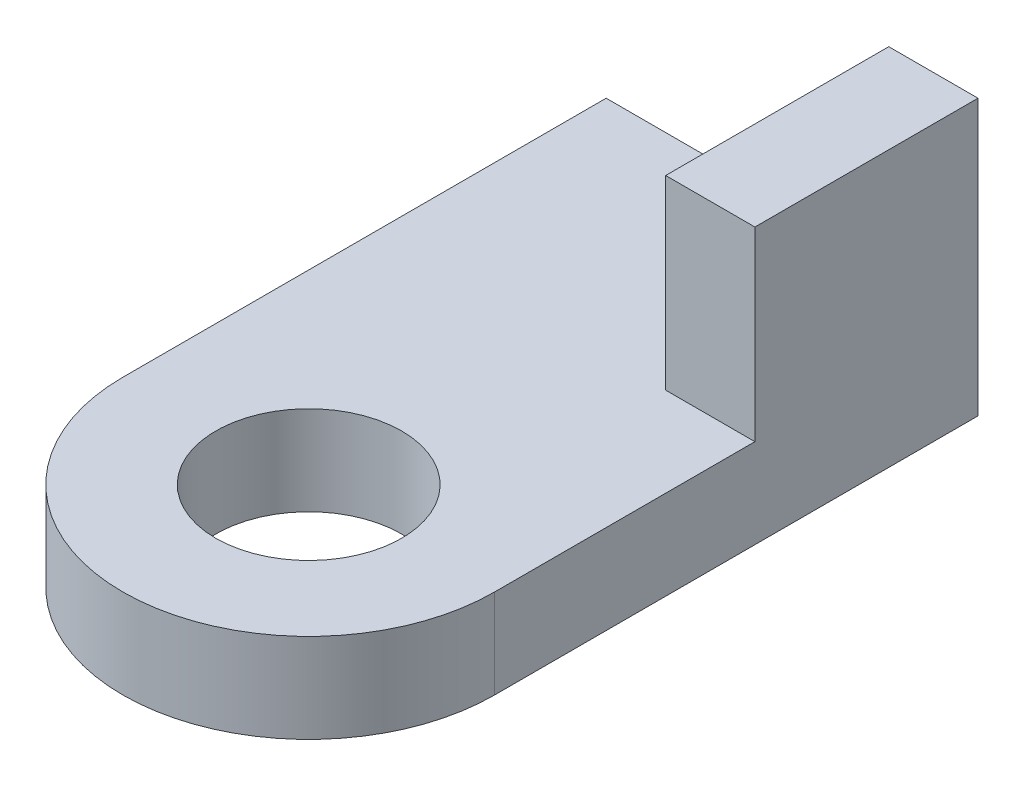
ISO-10303-21;
HEADER;
FILE_DESCRIPTION(('STEP AP214'),'2;1');
FILE_NAME('part.step','',(''),(''),'','','');
FILE_SCHEMA(('AUTOMOTIVE_DESIGN { 1 0 10303 214 1 1 1 1 }'));
ENDSEC;
DATA;
#1=APPLICATION_CONTEXT('core data for automotive mechanical design processes');
#2=APPLICATION_PROTOCOL_DEFINITION('international standard','automotive_design',2000,#1);
#3=PRODUCT_CONTEXT('',#1,'mechanical');
#4=PRODUCT('Part','Part','',(#3));
#5=PRODUCT_RELATED_PRODUCT_CATEGORY('part','',(#4));
#6=PRODUCT_DEFINITION_FORMATION('','',#4);
#7=PRODUCT_DEFINITION_CONTEXT('part definition',#1,'design');
#8=PRODUCT_DEFINITION('design','',#6,#7);
#9=PRODUCT_DEFINITION_SHAPE('','',#8);
#10=(LENGTH_UNIT() NAMED_UNIT(*) SI_UNIT(.MILLI.,.METRE.));
#11=(NAMED_UNIT(*) PLANE_ANGLE_UNIT() SI_UNIT($,.RADIAN.));
#12=(NAMED_UNIT(*) SI_UNIT($,.STERADIAN.) SOLID_ANGLE_UNIT());
#13=UNCERTAINTY_MEASURE_WITH_UNIT(LENGTH_MEASURE(1.E-05),#10,'distance_accuracy_value','');
#14=(GEOMETRIC_REPRESENTATION_CONTEXT(3) GLOBAL_UNCERTAINTY_ASSIGNED_CONTEXT((#13)) GLOBAL_UNIT_ASSIGNED_CONTEXT((#10,
#11,#12)) REPRESENTATION_CONTEXT('',''));
#15=CARTESIAN_POINT('',(0.,0.,0.));
#16=DIRECTION('',(0.,0.,1.));
#17=DIRECTION('',(1.,0.,0.));
#18=AXIS2_PLACEMENT_3D('',#15,#16,#17);
#19=CARTESIAN_POINT('',(0.,12.,0.));
#20=DIRECTION('',(0.,-1.,0.));
#21=DIRECTION('',(0.,0.,-1.));
#22=AXIS2_PLACEMENT_3D('',#19,#20,#21);
#23=PLANE('',#22);
#24=CARTESIAN_POINT('',(25.,12.,65.0000000000001));
#25=DIRECTION('',(0.,1.,0.));
#26=DIRECTION('',(0.,0.,1.));
#27=AXIS2_PLACEMENT_3D('',#24,#25,#26);
#28=CIRCLE('',#27,12.5);
#29=CARTESIAN_POINT('',(25.,12.,77.5000000000001));
#30=VERTEX_POINT('',#29);
#31=EDGE_CURVE('E128',#30,#30,#28,.T.);
#32=ORIENTED_EDGE('',*,*,#31,.F.);
#33=EDGE_LOOP('',(#32));
#34=FACE_BOUND('',#33,.T.);
#35=DIRECTION('',(1.,0.,0.));
#36=VECTOR('',#35,1.);
#37=CARTESIAN_POINT('',(38.,12.,30.));
#38=LINE('',#37,#36);
#39=CARTESIAN_POINT('',(38.,12.,30.));
#40=VERTEX_POINT('',#39);
#41=CARTESIAN_POINT('',(50.,12.,30.));
#42=VERTEX_POINT('',#41);
#43=EDGE_CURVE('E126',#40,#42,#38,.T.);
#44=ORIENTED_EDGE('',*,*,#43,.F.);
#45=DIRECTION('',(0.,0.,1.));
#46=VECTOR('',#45,1.);
#47=CARTESIAN_POINT('',(38.,12.,0.));
#48=LINE('',#47,#46);
#49=CARTESIAN_POINT('',(38.,12.,0.));
#50=VERTEX_POINT('',#49);
#51=EDGE_CURVE('E60',#50,#40,#48,.T.);
#52=ORIENTED_EDGE('',*,*,#51,.F.);
#53=DIRECTION('',(1.,0.,0.));
#54=VECTOR('',#53,1.);
#55=CARTESIAN_POINT('',(0.,12.,0.));
#56=LINE('',#55,#54);
#57=CARTESIAN_POINT('',(0.,12.,0.));
#58=VERTEX_POINT('',#57);
#59=EDGE_CURVE('E155',#58,#50,#56,.T.);
#60=ORIENTED_EDGE('',*,*,#59,.F.);
#61=DIRECTION('',(0.,0.,-1.));
#62=VECTOR('',#61,1.);
#63=CARTESIAN_POINT('',(0.,12.,65.));
#64=LINE('',#63,#62);
#65=CARTESIAN_POINT('',(0.,12.,65.));
#66=VERTEX_POINT('',#65);
#67=EDGE_CURVE('E151',#66,#58,#64,.T.);
#68=ORIENTED_EDGE('',*,*,#67,.F.);
#69=CARTESIAN_POINT('',(25.,12.,65.));
#70=DIRECTION('',(0.,1.,0.));
#71=DIRECTION('',(0.,0.,1.));
#72=AXIS2_PLACEMENT_3D('',#69,#70,#71);
#73=CIRCLE('',#72,25.);
#74=CARTESIAN_POINT('',(50.,12.,65.));
#75=VERTEX_POINT('',#74);
#76=EDGE_CURVE('E143',#66,#75,#73,.T.);
#77=ORIENTED_EDGE('',*,*,#76,.T.);
#78=DIRECTION('',(0.,0.,1.));
#79=VECTOR('',#78,1.);
#80=CARTESIAN_POINT('',(50.,12.,0.));
#81=LINE('',#80,#79);
#82=EDGE_CURVE('E66',#42,#75,#81,.T.);
#83=ORIENTED_EDGE('',*,*,#82,.F.);
#84=EDGE_LOOP('',(#44,#52,#60,#68,#77,#83));
#85=FACE_BOUND('',#84,.T.);
#86=ADVANCED_FACE('F42',(#34,#85),#23,.F.);
#87=CARTESIAN_POINT('',(50.,12.,0.));
#88=DIRECTION('',(1.,0.,0.));
#89=DIRECTION('',(0.,0.,-1.));
#90=AXIS2_PLACEMENT_3D('',#87,#88,#89);
#91=PLANE('',#90);
#92=DIRECTION('',(0.,0.,1.));
#93=VECTOR('',#92,1.);
#94=CARTESIAN_POINT('',(50.,0.,0.));
#95=LINE('',#94,#93);
#96=CARTESIAN_POINT('',(50.,0.,0.));
#97=VERTEX_POINT('',#96);
#98=CARTESIAN_POINT('',(50.,0.,65.));
#99=VERTEX_POINT('',#98);
#100=EDGE_CURVE('E156',#97,#99,#95,.T.);
#101=ORIENTED_EDGE('',*,*,#100,.F.);
#102=DIRECTION('',(0.,-1.,0.));
#103=VECTOR('',#102,1.);
#104=CARTESIAN_POINT('',(50.,12.,0.));
#105=LINE('',#104,#103);
#106=CARTESIAN_POINT('',(50.,37.,0.));
#107=VERTEX_POINT('',#106);
#108=EDGE_CURVE('E52',#107,#97,#105,.T.);
#109=ORIENTED_EDGE('',*,*,#108,.F.);
#110=DIRECTION('',(0.,0.,-1.));
#111=VECTOR('',#110,1.);
#112=CARTESIAN_POINT('',(50.,37.,30.));
#113=LINE('',#112,#111);
#114=CARTESIAN_POINT('',(50.,37.,30.));
#115=VERTEX_POINT('',#114);
#116=EDGE_CURVE('E103',#115,#107,#113,.T.);
#117=ORIENTED_EDGE('',*,*,#116,.F.);
#118=DIRECTION('',(0.,-1.,0.));
#119=VECTOR('',#118,1.);
#120=CARTESIAN_POINT('',(50.,37.,30.));
#121=LINE('',#120,#119);
#122=EDGE_CURVE('E108',#115,#42,#121,.T.);
#123=ORIENTED_EDGE('',*,*,#122,.T.);
#124=ORIENTED_EDGE('',*,*,#82,.T.);
#125=DIRECTION('',(0.,-1.,0.));
#126=VECTOR('',#125,1.);
#127=CARTESIAN_POINT('',(50.,12.,65.));
#128=LINE('',#127,#126);
#129=EDGE_CURVE('E11',#75,#99,#128,.T.);
#130=ORIENTED_EDGE('',*,*,#129,.T.);
#131=EDGE_LOOP('',(#101,#109,#117,#123,#124,#130));
#132=FACE_BOUND('',#131,.T.);
#133=ADVANCED_FACE('F106',(#132),#91,.T.);
#134=CARTESIAN_POINT('',(0.,12.,0.));
#135=DIRECTION('',(0.,0.,-1.));
#136=DIRECTION('',(-1.,0.,0.));
#137=AXIS2_PLACEMENT_3D('',#134,#135,#136);
#138=PLANE('',#137);
#139=DIRECTION('',(1.,0.,0.));
#140=VECTOR('',#139,1.);
#141=CARTESIAN_POINT('',(0.,0.,0.));
#142=LINE('',#141,#140);
#143=CARTESIAN_POINT('',(0.,0.,0.));
#144=VERTEX_POINT('',#143);
#145=EDGE_CURVE('E164',#144,#97,#142,.T.);
#146=ORIENTED_EDGE('',*,*,#145,.F.);
#147=DIRECTION('',(0.,-1.,0.));
#148=VECTOR('',#147,1.);
#149=CARTESIAN_POINT('',(0.,12.,0.));
#150=LINE('',#149,#148);
#151=EDGE_CURVE('E172',#58,#144,#150,.T.);
#152=ORIENTED_EDGE('',*,*,#151,.F.);
#153=ORIENTED_EDGE('',*,*,#59,.T.);
#154=DIRECTION('',(0.,-1.,0.));
#155=VECTOR('',#154,1.);
#156=CARTESIAN_POINT('',(38.,37.,0.));
#157=LINE('',#156,#155);
#158=CARTESIAN_POINT('',(38.,37.,0.));
#159=VERTEX_POINT('',#158);
#160=EDGE_CURVE('E129',#159,#50,#157,.T.);
#161=ORIENTED_EDGE('',*,*,#160,.F.);
#162=DIRECTION('',(-1.,0.,0.));
#163=VECTOR('',#162,1.);
#164=CARTESIAN_POINT('',(50.,37.,0.));
#165=LINE('',#164,#163);
#166=EDGE_CURVE('E113',#107,#159,#165,.T.);
#167=ORIENTED_EDGE('',*,*,#166,.F.);
#168=ORIENTED_EDGE('',*,*,#108,.T.);
#169=EDGE_LOOP('',(#146,#152,#153,#161,#167,#168));
#170=FACE_BOUND('',#169,.T.);
#171=ADVANCED_FACE('F188',(#170),#138,.T.);
#172=CARTESIAN_POINT('',(0.,12.,65.));
#173=DIRECTION('',(-1.,0.,0.));
#174=DIRECTION('',(0.,0.,1.));
#175=AXIS2_PLACEMENT_3D('',#172,#173,#174);
#176=PLANE('',#175);
#177=DIRECTION('',(0.,0.,-1.));
#178=VECTOR('',#177,1.);
#179=CARTESIAN_POINT('',(0.,0.,65.));
#180=LINE('',#179,#178);
#181=CARTESIAN_POINT('',(0.,0.,65.));
#182=VERTEX_POINT('',#181);
#183=EDGE_CURVE('E148',#182,#144,#180,.T.);
#184=ORIENTED_EDGE('',*,*,#183,.F.);
#185=DIRECTION('',(0.,-1.,0.));
#186=VECTOR('',#185,1.);
#187=CARTESIAN_POINT('',(0.,12.,65.));
#188=LINE('',#187,#186);
#189=EDGE_CURVE('E46',#66,#182,#188,.T.);
#190=ORIENTED_EDGE('',*,*,#189,.F.);
#191=ORIENTED_EDGE('',*,*,#67,.T.);
#192=ORIENTED_EDGE('',*,*,#151,.T.);
#193=EDGE_LOOP('',(#184,#190,#191,#192));
#194=FACE_BOUND('',#193,.T.);
#195=ADVANCED_FACE('F44',(#194),#176,.T.);
#196=CARTESIAN_POINT('',(0.,0.,0.));
#197=DIRECTION('',(0.,-1.,0.));
#198=DIRECTION('',(0.,0.,-1.));
#199=AXIS2_PLACEMENT_3D('',#196,#197,#198);
#200=PLANE('',#199);
#201=CARTESIAN_POINT('',(25.,0.,65.0000000000001));
#202=DIRECTION('',(0.,1.,0.));
#203=DIRECTION('',(0.,0.,1.));
#204=AXIS2_PLACEMENT_3D('',#201,#202,#203);
#205=CIRCLE('',#204,12.5);
#206=CARTESIAN_POINT('',(25.,0.,77.5000000000001));
#207=VERTEX_POINT('',#206);
#208=EDGE_CURVE('E134',#207,#207,#205,.T.);
#209=ORIENTED_EDGE('',*,*,#208,.T.);
#210=EDGE_LOOP('',(#209));
#211=FACE_BOUND('',#210,.T.);
#212=ORIENTED_EDGE('',*,*,#100,.T.);
#213=CARTESIAN_POINT('',(25.,0.,65.));
#214=DIRECTION('',(0.,1.,0.));
#215=DIRECTION('',(0.,0.,1.));
#216=AXIS2_PLACEMENT_3D('',#213,#214,#215);
#217=CIRCLE('',#216,25.);
#218=EDGE_CURVE('E145',#182,#99,#217,.T.);
#219=ORIENTED_EDGE('',*,*,#218,.F.);
#220=ORIENTED_EDGE('',*,*,#183,.T.);
#221=ORIENTED_EDGE('',*,*,#145,.T.);
#222=EDGE_LOOP('',(#212,#219,#220,#221));
#223=FACE_BOUND('',#222,.T.);
#224=ADVANCED_FACE('F185',(#211,#223),#200,.T.);
#225=CARTESIAN_POINT('',(25.,0.,65.));
#226=DIRECTION('',(0.,1.,0.));
#227=DIRECTION('',(0.,0.,1.));
#228=AXIS2_PLACEMENT_3D('',#225,#226,#227);
#229=CYLINDRICAL_SURFACE('',#228,25.);
#230=ORIENTED_EDGE('',*,*,#76,.F.);
#231=ORIENTED_EDGE('',*,*,#189,.T.);
#232=ORIENTED_EDGE('',*,*,#218,.T.);
#233=ORIENTED_EDGE('',*,*,#129,.F.);
#234=EDGE_LOOP('',(#230,#231,#232,#233));
#235=FACE_BOUND('',#234,.T.);
#236=ADVANCED_FACE('F181',(#235),#229,.T.);
#237=CARTESIAN_POINT('',(25.,0.,65.0000000000001));
#238=DIRECTION('',(0.,1.,0.));
#239=DIRECTION('',(0.,0.,1.));
#240=AXIS2_PLACEMENT_3D('',#237,#238,#239);
#241=CYLINDRICAL_SURFACE('',#240,12.5);
#242=ORIENTED_EDGE('',*,*,#208,.F.);
#243=EDGE_LOOP('',(#242));
#244=FACE_BOUND('',#243,.T.);
#245=ORIENTED_EDGE('',*,*,#31,.T.);
#246=EDGE_LOOP('',(#245));
#247=FACE_BOUND('',#246,.T.);
#248=ADVANCED_FACE('F207',(#244,#247),#241,.F.);
#249=CARTESIAN_POINT('',(38.,37.,30.));
#250=DIRECTION('',(0.,0.,-1.));
#251=DIRECTION('',(-1.,0.,0.));
#252=AXIS2_PLACEMENT_3D('',#249,#250,#251);
#253=PLANE('',#252);
#254=ORIENTED_EDGE('',*,*,#43,.T.);
#255=ORIENTED_EDGE('',*,*,#122,.F.);
#256=DIRECTION('',(1.,0.,0.));
#257=VECTOR('',#256,1.);
#258=CARTESIAN_POINT('',(38.,37.,30.));
#259=LINE('',#258,#257);
#260=CARTESIAN_POINT('',(38.,37.,30.));
#261=VERTEX_POINT('',#260);
#262=EDGE_CURVE('E114',#261,#115,#259,.T.);
#263=ORIENTED_EDGE('',*,*,#262,.F.);
#264=DIRECTION('',(0.,-1.,0.));
#265=VECTOR('',#264,1.);
#266=CARTESIAN_POINT('',(38.,37.,30.));
#267=LINE('',#266,#265);
#268=EDGE_CURVE('E137',#261,#40,#267,.T.);
#269=ORIENTED_EDGE('',*,*,#268,.T.);
#270=EDGE_LOOP('',(#254,#255,#263,#269));
#271=FACE_BOUND('',#270,.T.);
#272=ADVANCED_FACE('F125',(#271),#253,.F.);
#273=CARTESIAN_POINT('',(38.,37.,0.));
#274=DIRECTION('',(1.,0.,0.));
#275=DIRECTION('',(0.,0.,-1.));
#276=AXIS2_PLACEMENT_3D('',#273,#274,#275);
#277=PLANE('',#276);
#278=ORIENTED_EDGE('',*,*,#51,.T.);
#279=ORIENTED_EDGE('',*,*,#268,.F.);
#280=DIRECTION('',(0.,0.,1.));
#281=VECTOR('',#280,1.);
#282=CARTESIAN_POINT('',(38.,37.,0.));
#283=LINE('',#282,#281);
#284=EDGE_CURVE('E119',#159,#261,#283,.T.);
#285=ORIENTED_EDGE('',*,*,#284,.F.);
#286=ORIENTED_EDGE('',*,*,#160,.T.);
#287=EDGE_LOOP('',(#278,#279,#285,#286));
#288=FACE_BOUND('',#287,.T.);
#289=ADVANCED_FACE('F190',(#288),#277,.F.);
#290=CARTESIAN_POINT('',(0.,37.,0.));
#291=DIRECTION('',(0.,1.,0.));
#292=DIRECTION('',(0.,0.,1.));
#293=AXIS2_PLACEMENT_3D('',#290,#291,#292);
#294=PLANE('',#293);
#295=ORIENTED_EDGE('',*,*,#262,.T.);
#296=ORIENTED_EDGE('',*,*,#116,.T.);
#297=ORIENTED_EDGE('',*,*,#166,.T.);
#298=ORIENTED_EDGE('',*,*,#284,.T.);
#299=EDGE_LOOP('',(#295,#296,#297,#298));
#300=FACE_BOUND('',#299,.T.);
#301=ADVANCED_FACE('F117',(#300),#294,.T.);
#302=CLOSED_SHELL('',(#86,#133,#171,#195,#224,#236,#248,#272,#289,#301));
#303=MANIFOLD_SOLID_BREP('B2',#302);
#304=ADVANCED_BREP_SHAPE_REPRESENTATION('',(#18,#303),#14);
#305=SHAPE_DEFINITION_REPRESENTATION(#9,#304);
ENDSEC;
END-ISO-10303-21;
